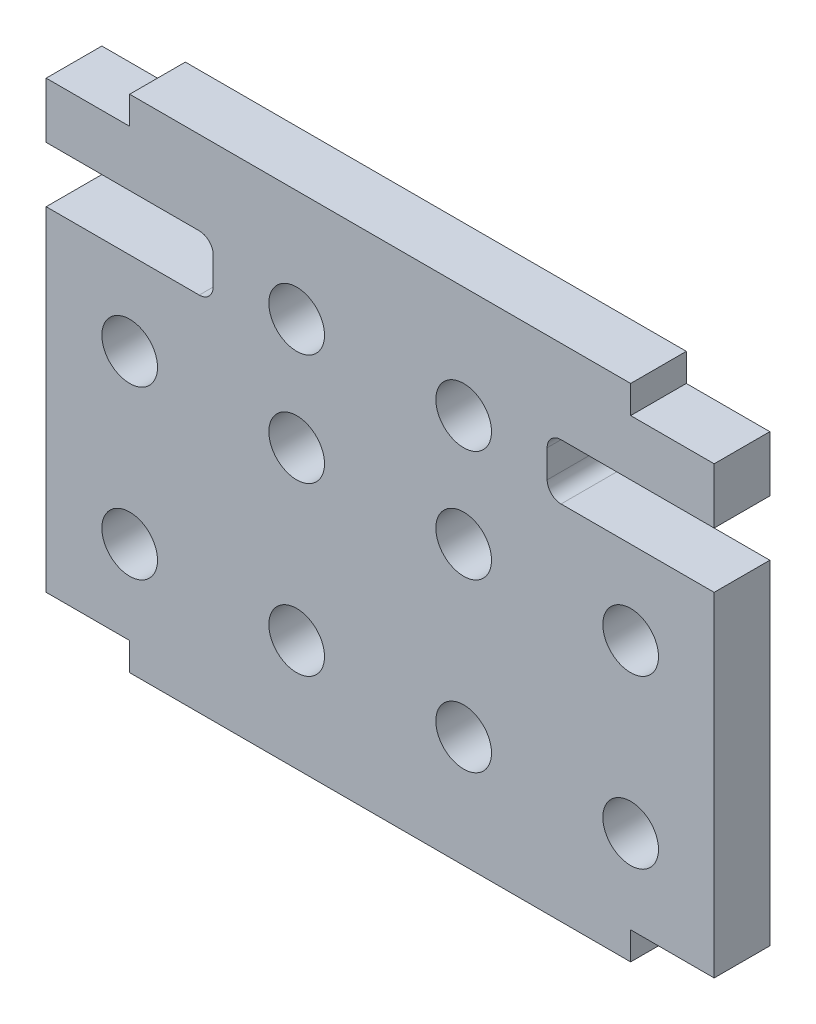
ISO-10303-21;
HEADER;
FILE_DESCRIPTION(('STEP AP214'),'2;1');
FILE_NAME('part.step','',(''),(''),'','','');
FILE_SCHEMA(('AUTOMOTIVE_DESIGN { 1 0 10303 214 1 1 1 1 }'));
ENDSEC;
DATA;
#1=APPLICATION_CONTEXT('core data for automotive mechanical design processes');
#2=APPLICATION_PROTOCOL_DEFINITION('international standard','automotive_design',2000,#1);
#3=PRODUCT_CONTEXT('',#1,'mechanical');
#4=PRODUCT('Part','Part','',(#3));
#5=PRODUCT_RELATED_PRODUCT_CATEGORY('part','',(#4));
#6=PRODUCT_DEFINITION_FORMATION('','',#4);
#7=PRODUCT_DEFINITION_CONTEXT('part definition',#1,'design');
#8=PRODUCT_DEFINITION('design','',#6,#7);
#9=PRODUCT_DEFINITION_SHAPE('','',#8);
#10=(LENGTH_UNIT() NAMED_UNIT(*) SI_UNIT(.MILLI.,.METRE.));
#11=(NAMED_UNIT(*) PLANE_ANGLE_UNIT() SI_UNIT($,.RADIAN.));
#12=(NAMED_UNIT(*) SI_UNIT($,.STERADIAN.) SOLID_ANGLE_UNIT());
#13=UNCERTAINTY_MEASURE_WITH_UNIT(LENGTH_MEASURE(1.E-05),#10,'distance_accuracy_value','');
#14=(GEOMETRIC_REPRESENTATION_CONTEXT(3) GLOBAL_UNCERTAINTY_ASSIGNED_CONTEXT((#13)) GLOBAL_UNIT_ASSIGNED_CONTEXT((#10,
#11,#12)) REPRESENTATION_CONTEXT('',''));
#15=CARTESIAN_POINT('',(0.,0.,0.));
#16=DIRECTION('',(0.,0.,1.));
#17=DIRECTION('',(1.,0.,0.));
#18=AXIS2_PLACEMENT_3D('',#15,#16,#17);
#19=CARTESIAN_POINT('',(114.1251726557,201.3393309863,3.));
#20=DIRECTION('',(0.,0.,1.));
#21=DIRECTION('',(1.,0.,0.));
#22=AXIS2_PLACEMENT_3D('',#19,#20,#21);
#23=PLANE('',#22);
#24=CARTESIAN_POINT('',(110.3751723055,194.5893309863,3.));
#25=DIRECTION('',(0.,0.,1.));
#26=DIRECTION('',(1.,0.,0.));
#27=AXIS2_PLACEMENT_3D('',#24,#25,#26);
#28=CIRCLE('',#27,1.5);
#29=CARTESIAN_POINT('',(111.8751723055,194.5893309863,3.));
#30=VERTEX_POINT('',#29);
#31=EDGE_CURVE('E472',#30,#30,#28,.T.);
#32=ORIENTED_EDGE('',*,*,#31,.F.);
#33=EDGE_LOOP('',(#32));
#34=FACE_BOUND('',#33,.T.);
#35=CARTESIAN_POINT('',(137.3751723055,194.5893309863,3.));
#36=DIRECTION('',(0.,0.,1.));
#37=DIRECTION('',(1.,0.,0.));
#38=AXIS2_PLACEMENT_3D('',#35,#36,#37);
#39=CIRCLE('',#38,1.5);
#40=CARTESIAN_POINT('',(138.8751723055,194.5893309863,3.));
#41=VERTEX_POINT('',#40);
#42=EDGE_CURVE('E484',#41,#41,#39,.T.);
#43=ORIENTED_EDGE('',*,*,#42,.F.);
#44=EDGE_LOOP('',(#43));
#45=FACE_BOUND('',#44,.T.);
#46=CARTESIAN_POINT('',(110.3751723055,185.5893309863,3.));
#47=DIRECTION('',(0.,0.,1.));
#48=DIRECTION('',(1.,0.,0.));
#49=AXIS2_PLACEMENT_3D('',#46,#47,#48);
#50=CIRCLE('',#49,1.5);
#51=CARTESIAN_POINT('',(111.8751723055,185.5893309863,3.));
#52=VERTEX_POINT('',#51);
#53=EDGE_CURVE('E496',#52,#52,#50,.T.);
#54=ORIENTED_EDGE('',*,*,#53,.F.);
#55=EDGE_LOOP('',(#54));
#56=FACE_BOUND('',#55,.T.);
#57=CARTESIAN_POINT('',(137.3751723055,185.5893309863,3.));
#58=DIRECTION('',(0.,0.,1.));
#59=DIRECTION('',(1.,0.,0.));
#60=AXIS2_PLACEMENT_3D('',#57,#58,#59);
#61=CIRCLE('',#60,1.5);
#62=CARTESIAN_POINT('',(138.8751723055,185.5893309863,3.));
#63=VERTEX_POINT('',#62);
#64=EDGE_CURVE('E508',#63,#63,#61,.T.);
#65=ORIENTED_EDGE('',*,*,#64,.F.);
#66=EDGE_LOOP('',(#65));
#67=FACE_BOUND('',#66,.T.);
#68=CARTESIAN_POINT('',(128.3751726557,200.5893309863,3.));
#69=DIRECTION('',(0.,0.,1.));
#70=DIRECTION('',(1.,0.,0.));
#71=AXIS2_PLACEMENT_3D('',#68,#69,#70);
#72=CIRCLE('',#71,1.5);
#73=CARTESIAN_POINT('',(129.8751726557,200.5893309863,3.));
#74=VERTEX_POINT('',#73);
#75=EDGE_CURVE('E230',#74,#74,#72,.T.);
#76=ORIENTED_EDGE('',*,*,#75,.F.);
#77=EDGE_LOOP('',(#76));
#78=FACE_BOUND('',#77,.T.);
#79=CARTESIAN_POINT('',(114.1251726557,201.3393309863,3.));
#80=DIRECTION('',(0.,0.,-1.));
#81=DIRECTION('',(1.,0.,0.));
#82=AXIS2_PLACEMENT_3D('',#79,#80,#81);
#83=CIRCLE('',#82,0.750000000000001);
#84=CARTESIAN_POINT('',(114.1251726557,202.0893309863,3.));
#85=VERTEX_POINT('',#84);
#86=CARTESIAN_POINT('',(114.8751726557,201.3393309863,3.));
#87=VERTEX_POINT('',#86);
#88=EDGE_CURVE('E273',#85,#87,#83,.T.);
#89=ORIENTED_EDGE('',*,*,#88,.T.);
#90=DIRECTION('',(0.,-1.,0.));
#91=VECTOR('',#90,1.);
#92=CARTESIAN_POINT('',(114.8751726557,201.3393309863,3.));
#93=LINE('',#92,#91);
#94=CARTESIAN_POINT('',(114.8751726557,199.8393309863,3.));
#95=VERTEX_POINT('',#94);
#96=EDGE_CURVE('E141',#87,#95,#93,.T.);
#97=ORIENTED_EDGE('',*,*,#96,.T.);
#98=CARTESIAN_POINT('',(114.1251726557,199.8393309863,3.));
#99=DIRECTION('',(0.,0.,-1.));
#100=DIRECTION('',(1.,0.,0.));
#101=AXIS2_PLACEMENT_3D('',#98,#99,#100);
#102=CIRCLE('',#101,0.750000000000001);
#103=CARTESIAN_POINT('',(114.1251726557,199.0893309863,3.));
#104=VERTEX_POINT('',#103);
#105=EDGE_CURVE('E336',#95,#104,#102,.T.);
#106=ORIENTED_EDGE('',*,*,#105,.T.);
#107=DIRECTION('',(-1.,0.,0.));
#108=VECTOR('',#107,1.);
#109=CARTESIAN_POINT('',(114.1251726557,199.0893309863,3.));
#110=LINE('',#109,#108);
#111=CARTESIAN_POINT('',(105.8751726557,199.0893309863,3.));
#112=VERTEX_POINT('',#111);
#113=EDGE_CURVE('E355',#104,#112,#110,.T.);
#114=ORIENTED_EDGE('',*,*,#113,.T.);
#115=DIRECTION('',(0.,-1.,0.));
#116=VECTOR('',#115,1.);
#117=CARTESIAN_POINT('',(105.8751726557,199.0893309863,3.));
#118=LINE('',#117,#116);
#119=CARTESIAN_POINT('',(105.8751726557,181.0893309863,3.));
#120=VERTEX_POINT('',#119);
#121=EDGE_CURVE('E352',#112,#120,#118,.T.);
#122=ORIENTED_EDGE('',*,*,#121,.T.);
#123=DIRECTION('',(1.,0.,0.));
#124=VECTOR('',#123,1.);
#125=CARTESIAN_POINT('',(110.3751723055,181.0893309863,3.));
#126=LINE('',#125,#124);
#127=CARTESIAN_POINT('',(110.3751723055,181.0893309863,3.));
#128=VERTEX_POINT('',#127);
#129=EDGE_CURVE('E354',#120,#128,#126,.T.);
#130=ORIENTED_EDGE('',*,*,#129,.T.);
#131=DIRECTION('',(0.,-1.,0.));
#132=VECTOR('',#131,1.);
#133=CARTESIAN_POINT('',(110.3751723055,179.5893309863,3.));
#134=LINE('',#133,#132);
#135=CARTESIAN_POINT('',(110.3751723055,179.5893309863,3.));
#136=VERTEX_POINT('',#135);
#137=EDGE_CURVE('E357',#128,#136,#134,.T.);
#138=ORIENTED_EDGE('',*,*,#137,.T.);
#139=DIRECTION('',(1.,0.,0.));
#140=VECTOR('',#139,1.);
#141=CARTESIAN_POINT('',(137.3751726557,179.5893309863,3.));
#142=LINE('',#141,#140);
#143=CARTESIAN_POINT('',(137.3751726557,179.5893309863,3.));
#144=VERTEX_POINT('',#143);
#145=EDGE_CURVE('E363',#136,#144,#142,.T.);
#146=ORIENTED_EDGE('',*,*,#145,.T.);
#147=DIRECTION('',(0.,1.,0.));
#148=VECTOR('',#147,1.);
#149=CARTESIAN_POINT('',(137.3751726557,181.0893309863,3.));
#150=LINE('',#149,#148);
#151=CARTESIAN_POINT('',(137.3751726557,181.0893309863,3.));
#152=VERTEX_POINT('',#151);
#153=EDGE_CURVE('E365',#144,#152,#150,.T.);
#154=ORIENTED_EDGE('',*,*,#153,.T.);
#155=DIRECTION('',(1.,0.,0.));
#156=VECTOR('',#155,1.);
#157=CARTESIAN_POINT('',(141.8751726557,181.0893309863,3.));
#158=LINE('',#157,#156);
#159=CARTESIAN_POINT('',(141.8751726557,181.0893309863,3.));
#160=VERTEX_POINT('',#159);
#161=EDGE_CURVE('E367',#152,#160,#158,.T.);
#162=ORIENTED_EDGE('',*,*,#161,.T.);
#163=DIRECTION('',(0.,1.,0.));
#164=VECTOR('',#163,1.);
#165=CARTESIAN_POINT('',(141.8751726557,199.0893309863,3.));
#166=LINE('',#165,#164);
#167=CARTESIAN_POINT('',(141.8751726557,199.0893309863,3.));
#168=VERTEX_POINT('',#167);
#169=EDGE_CURVE('E369',#160,#168,#166,.T.);
#170=ORIENTED_EDGE('',*,*,#169,.T.);
#171=DIRECTION('',(-0.99999999999909,-1.34897035860248E-06,0.));
#172=VECTOR('',#171,1.);
#173=CARTESIAN_POINT('',(133.6251767026,199.0893198573,3.));
#174=LINE('',#173,#172);
#175=CARTESIAN_POINT('',(133.6251767026,199.0893198573,3.));
#176=VERTEX_POINT('',#175);
#177=EDGE_CURVE('E371',#168,#176,#174,.T.);
#178=ORIENTED_EDGE('',*,*,#177,.T.);
#179=CARTESIAN_POINT('',(133.625175690899,199.839319857299,3.));
#180=DIRECTION('',(0.,0.,-1.));
#181=DIRECTION('',(1.,0.,0.));
#182=AXIS2_PLACEMENT_3D('',#179,#180,#181);
#183=CIRCLE('',#182,0.750000000000003);
#184=CARTESIAN_POINT('',(132.8751756909,199.8393188456,3.));
#185=VERTEX_POINT('',#184);
#186=EDGE_CURVE('E373',#176,#185,#183,.T.);
#187=ORIENTED_EDGE('',*,*,#186,.T.);
#188=DIRECTION('',(-1.34900000429397E-06,0.99999999999909,0.));
#189=VECTOR('',#188,1.);
#190=CARTESIAN_POINT('',(132.8751756909,199.8393188456,3.));
#191=LINE('',#190,#189);
#192=CARTESIAN_POINT('',(132.8751736674,201.3393188456,3.));
#193=VERTEX_POINT('',#192);
#194=EDGE_CURVE('E375',#185,#193,#191,.T.);
#195=ORIENTED_EDGE('',*,*,#194,.T.);
#196=CARTESIAN_POINT('',(133.625173667399,201.339319857301,3.));
#197=DIRECTION('',(0.,0.,-1.));
#198=DIRECTION('',(1.,0.,0.));
#199=AXIS2_PLACEMENT_3D('',#196,#197,#198);
#200=CIRCLE('',#199,0.749999999999989);
#201=CARTESIAN_POINT('',(133.6251726557,202.0893198573,3.));
#202=VERTEX_POINT('',#201);
#203=EDGE_CURVE('E377',#193,#202,#200,.T.);
#204=ORIENTED_EDGE('',*,*,#203,.T.);
#205=DIRECTION('',(0.99999999999909,1.34896969688756E-06,0.));
#206=VECTOR('',#205,1.);
#207=CARTESIAN_POINT('',(133.6251726557,202.0893198573,3.));
#208=LINE('',#207,#206);
#209=CARTESIAN_POINT('',(141.8751726557,202.0893309863,3.));
#210=VERTEX_POINT('',#209);
#211=EDGE_CURVE('E379',#202,#210,#208,.T.);
#212=ORIENTED_EDGE('',*,*,#211,.T.);
#213=DIRECTION('',(0.,1.,0.));
#214=VECTOR('',#213,1.);
#215=CARTESIAN_POINT('',(141.8751726557,205.0893309863,3.));
#216=LINE('',#215,#214);
#217=CARTESIAN_POINT('',(141.8751726557,205.0893309863,3.));
#218=VERTEX_POINT('',#217);
#219=EDGE_CURVE('E381',#210,#218,#216,.T.);
#220=ORIENTED_EDGE('',*,*,#219,.T.);
#221=DIRECTION('',(-1.,0.,0.));
#222=VECTOR('',#221,1.);
#223=CARTESIAN_POINT('',(137.3751726557,205.0893309863,3.));
#224=LINE('',#223,#222);
#225=CARTESIAN_POINT('',(137.3751726557,205.0893309863,3.));
#226=VERTEX_POINT('',#225);
#227=EDGE_CURVE('E383',#218,#226,#224,.T.);
#228=ORIENTED_EDGE('',*,*,#227,.T.);
#229=DIRECTION('',(0.,1.,0.));
#230=VECTOR('',#229,1.);
#231=CARTESIAN_POINT('',(137.3751726557,206.5893309863,3.));
#232=LINE('',#231,#230);
#233=CARTESIAN_POINT('',(137.3751726557,206.5893309863,3.));
#234=VERTEX_POINT('',#233);
#235=EDGE_CURVE('E385',#226,#234,#232,.T.);
#236=ORIENTED_EDGE('',*,*,#235,.T.);
#237=DIRECTION('',(-1.,0.,0.));
#238=VECTOR('',#237,1.);
#239=CARTESIAN_POINT('',(110.3751723055,206.5893309863,3.));
#240=LINE('',#239,#238);
#241=CARTESIAN_POINT('',(110.3751723055,206.5893309863,3.));
#242=VERTEX_POINT('',#241);
#243=EDGE_CURVE('E387',#234,#242,#240,.T.);
#244=ORIENTED_EDGE('',*,*,#243,.T.);
#245=DIRECTION('',(0.,-1.,0.));
#246=VECTOR('',#245,1.);
#247=CARTESIAN_POINT('',(110.3751723055,205.0893309863,3.));
#248=LINE('',#247,#246);
#249=CARTESIAN_POINT('',(110.3751723055,205.0893309863,3.));
#250=VERTEX_POINT('',#249);
#251=EDGE_CURVE('E208',#242,#250,#248,.T.);
#252=ORIENTED_EDGE('',*,*,#251,.T.);
#253=DIRECTION('',(-1.,0.,0.));
#254=VECTOR('',#253,1.);
#255=CARTESIAN_POINT('',(110.3751723055,205.0893309863,3.));
#256=LINE('',#255,#254);
#257=CARTESIAN_POINT('',(105.8751726557,205.0893309863,3.));
#258=VERTEX_POINT('',#257);
#259=EDGE_CURVE('E202',#250,#258,#256,.T.);
#260=ORIENTED_EDGE('',*,*,#259,.T.);
#261=DIRECTION('',(0.,-1.,0.));
#262=VECTOR('',#261,1.);
#263=CARTESIAN_POINT('',(105.8751726557,202.0893309863,3.));
#264=LINE('',#263,#262);
#265=CARTESIAN_POINT('',(105.8751726557,202.0893309863,3.));
#266=VERTEX_POINT('',#265);
#267=EDGE_CURVE('E206',#258,#266,#264,.T.);
#268=ORIENTED_EDGE('',*,*,#267,.T.);
#269=DIRECTION('',(1.,0.,0.));
#270=VECTOR('',#269,1.);
#271=CARTESIAN_POINT('',(114.1251726557,202.0893309863,3.));
#272=LINE('',#271,#270);
#273=EDGE_CURVE('E50',#266,#85,#272,.T.);
#274=ORIENTED_EDGE('',*,*,#273,.T.);
#275=EDGE_LOOP('',(#89,#97,#106,#114,#122,#130,#138,#146,#154,#162,#170,#178,#187,#195,#204,
#212,#220,#228,#236,#244,#252,#260,#268,#274));
#276=FACE_BOUND('',#275,.T.);
#277=CARTESIAN_POINT('',(119.3751726557,200.5893309863,3.));
#278=DIRECTION('',(0.,0.,1.));
#279=DIRECTION('',(1.,0.,0.));
#280=AXIS2_PLACEMENT_3D('',#277,#278,#279);
#281=CIRCLE('',#280,1.5);
#282=CARTESIAN_POINT('',(120.8751726557,200.5893309863,3.));
#283=VERTEX_POINT('',#282);
#284=EDGE_CURVE('E514',#283,#283,#281,.T.);
#285=ORIENTED_EDGE('',*,*,#284,.F.);
#286=EDGE_LOOP('',(#285));
#287=FACE_BOUND('',#286,.T.);
#288=CARTESIAN_POINT('',(128.3751723055,185.5893309863,3.));
#289=DIRECTION('',(0.,0.,1.));
#290=DIRECTION('',(1.,0.,0.));
#291=AXIS2_PLACEMENT_3D('',#288,#289,#290);
#292=CIRCLE('',#291,1.5);
#293=CARTESIAN_POINT('',(129.8751723055,185.5893309863,3.));
#294=VERTEX_POINT('',#293);
#295=EDGE_CURVE('E502',#294,#294,#292,.T.);
#296=ORIENTED_EDGE('',*,*,#295,.F.);
#297=EDGE_LOOP('',(#296));
#298=FACE_BOUND('',#297,.T.);
#299=CARTESIAN_POINT('',(119.3751723055,185.5893309863,3.));
#300=DIRECTION('',(0.,0.,1.));
#301=DIRECTION('',(1.,0.,0.));
#302=AXIS2_PLACEMENT_3D('',#299,#300,#301);
#303=CIRCLE('',#302,1.5);
#304=CARTESIAN_POINT('',(120.8751723055,185.5893309863,3.));
#305=VERTEX_POINT('',#304);
#306=EDGE_CURVE('E490',#305,#305,#303,.T.);
#307=ORIENTED_EDGE('',*,*,#306,.F.);
#308=EDGE_LOOP('',(#307));
#309=FACE_BOUND('',#308,.T.);
#310=CARTESIAN_POINT('',(128.3751723055,194.5893309863,3.));
#311=DIRECTION('',(0.,0.,1.));
#312=DIRECTION('',(1.,0.,0.));
#313=AXIS2_PLACEMENT_3D('',#310,#311,#312);
#314=CIRCLE('',#313,1.5);
#315=CARTESIAN_POINT('',(129.8751723055,194.5893309863,3.));
#316=VERTEX_POINT('',#315);
#317=EDGE_CURVE('E478',#316,#316,#314,.T.);
#318=ORIENTED_EDGE('',*,*,#317,.F.);
#319=EDGE_LOOP('',(#318));
#320=FACE_BOUND('',#319,.T.);
#321=CARTESIAN_POINT('',(119.3751723055,194.5893309863,3.));
#322=DIRECTION('',(0.,0.,1.));
#323=DIRECTION('',(1.,0.,0.));
#324=AXIS2_PLACEMENT_3D('',#321,#322,#323);
#325=CIRCLE('',#324,1.5);
#326=CARTESIAN_POINT('',(120.8751723055,194.5893309863,3.));
#327=VERTEX_POINT('',#326);
#328=EDGE_CURVE('E463',#327,#327,#325,.T.);
#329=ORIENTED_EDGE('',*,*,#328,.F.);
#330=EDGE_LOOP('',(#329));
#331=FACE_BOUND('',#330,.T.);
#332=ADVANCED_FACE('F33',(#34,#45,#56,#67,#78,#276,#287,#298,#309,#320,#331),#23,.T.);
#333=CARTESIAN_POINT('',(114.1251726557,201.3393309863,0.));
#334=DIRECTION('',(0.,0.,1.));
#335=DIRECTION('',(1.,0.,0.));
#336=AXIS2_PLACEMENT_3D('',#333,#334,#335);
#337=PLANE('',#336);
#338=CARTESIAN_POINT('',(110.3751723055,194.5893309863,0.));
#339=DIRECTION('',(0.,0.,1.));
#340=DIRECTION('',(1.,0.,0.));
#341=AXIS2_PLACEMENT_3D('',#338,#339,#340);
#342=CIRCLE('',#341,1.5);
#343=CARTESIAN_POINT('',(111.8751723055,194.5893309863,0.));
#344=VERTEX_POINT('',#343);
#345=EDGE_CURVE('E469',#344,#344,#342,.T.);
#346=ORIENTED_EDGE('',*,*,#345,.T.);
#347=EDGE_LOOP('',(#346));
#348=FACE_BOUND('',#347,.T.);
#349=CARTESIAN_POINT('',(137.3751723055,194.5893309863,0.));
#350=DIRECTION('',(0.,0.,1.));
#351=DIRECTION('',(1.,0.,0.));
#352=AXIS2_PLACEMENT_3D('',#349,#350,#351);
#353=CIRCLE('',#352,1.5);
#354=CARTESIAN_POINT('',(138.8751723055,194.5893309863,0.));
#355=VERTEX_POINT('',#354);
#356=EDGE_CURVE('E481',#355,#355,#353,.T.);
#357=ORIENTED_EDGE('',*,*,#356,.T.);
#358=EDGE_LOOP('',(#357));
#359=FACE_BOUND('',#358,.T.);
#360=CARTESIAN_POINT('',(110.3751723055,185.5893309863,0.));
#361=DIRECTION('',(0.,0.,1.));
#362=DIRECTION('',(1.,0.,0.));
#363=AXIS2_PLACEMENT_3D('',#360,#361,#362);
#364=CIRCLE('',#363,1.5);
#365=CARTESIAN_POINT('',(111.8751723055,185.5893309863,0.));
#366=VERTEX_POINT('',#365);
#367=EDGE_CURVE('E493',#366,#366,#364,.T.);
#368=ORIENTED_EDGE('',*,*,#367,.T.);
#369=EDGE_LOOP('',(#368));
#370=FACE_BOUND('',#369,.T.);
#371=CARTESIAN_POINT('',(137.3751723055,185.5893309863,0.));
#372=DIRECTION('',(0.,0.,1.));
#373=DIRECTION('',(1.,0.,0.));
#374=AXIS2_PLACEMENT_3D('',#371,#372,#373);
#375=CIRCLE('',#374,1.5);
#376=CARTESIAN_POINT('',(138.8751723055,185.5893309863,0.));
#377=VERTEX_POINT('',#376);
#378=EDGE_CURVE('E505',#377,#377,#375,.T.);
#379=ORIENTED_EDGE('',*,*,#378,.T.);
#380=EDGE_LOOP('',(#379));
#381=FACE_BOUND('',#380,.T.);
#382=CARTESIAN_POINT('',(128.3751726557,200.5893309863,0.));
#383=DIRECTION('',(0.,0.,1.));
#384=DIRECTION('',(1.,0.,0.));
#385=AXIS2_PLACEMENT_3D('',#382,#383,#384);
#386=CIRCLE('',#385,1.5);
#387=CARTESIAN_POINT('',(129.8751726557,200.5893309863,0.));
#388=VERTEX_POINT('',#387);
#389=EDGE_CURVE('E517',#388,#388,#386,.T.);
#390=ORIENTED_EDGE('',*,*,#389,.T.);
#391=EDGE_LOOP('',(#390));
#392=FACE_BOUND('',#391,.T.);
#393=CARTESIAN_POINT('',(114.1251726557,201.3393309863,0.));
#394=DIRECTION('',(0.,0.,-1.));
#395=DIRECTION('',(1.,0.,0.));
#396=AXIS2_PLACEMENT_3D('',#393,#394,#395);
#397=CIRCLE('',#396,0.750000000000001);
#398=CARTESIAN_POINT('',(114.1251726557,202.0893309863,0.));
#399=VERTEX_POINT('',#398);
#400=CARTESIAN_POINT('',(114.8751726557,201.3393309863,0.));
#401=VERTEX_POINT('',#400);
#402=EDGE_CURVE('E226',#399,#401,#397,.T.);
#403=ORIENTED_EDGE('',*,*,#402,.F.);
#404=DIRECTION('',(1.,0.,0.));
#405=VECTOR('',#404,1.);
#406=CARTESIAN_POINT('',(114.1251726557,202.0893309863,0.));
#407=LINE('',#406,#405);
#408=CARTESIAN_POINT('',(105.8751726557,202.0893309863,0.));
#409=VERTEX_POINT('',#408);
#410=EDGE_CURVE('E133',#409,#399,#407,.T.);
#411=ORIENTED_EDGE('',*,*,#410,.F.);
#412=DIRECTION('',(0.,-1.,0.));
#413=VECTOR('',#412,1.);
#414=CARTESIAN_POINT('',(105.8751726557,202.0893309863,0.));
#415=LINE('',#414,#413);
#416=CARTESIAN_POINT('',(105.8751726557,205.0893309863,0.));
#417=VERTEX_POINT('',#416);
#418=EDGE_CURVE('E127',#417,#409,#415,.T.);
#419=ORIENTED_EDGE('',*,*,#418,.F.);
#420=DIRECTION('',(-1.,0.,0.));
#421=VECTOR('',#420,1.);
#422=CARTESIAN_POINT('',(110.3751723055,205.0893309863,0.));
#423=LINE('',#422,#421);
#424=CARTESIAN_POINT('',(110.3751723055,205.0893309863,0.));
#425=VERTEX_POINT('',#424);
#426=EDGE_CURVE('E216',#425,#417,#423,.T.);
#427=ORIENTED_EDGE('',*,*,#426,.F.);
#428=DIRECTION('',(0.,-1.,0.));
#429=VECTOR('',#428,1.);
#430=CARTESIAN_POINT('',(110.3751723055,205.0893309863,0.));
#431=LINE('',#430,#429);
#432=CARTESIAN_POINT('',(110.3751723055,206.5893309863,0.));
#433=VERTEX_POINT('',#432);
#434=EDGE_CURVE('E268',#433,#425,#431,.T.);
#435=ORIENTED_EDGE('',*,*,#434,.F.);
#436=DIRECTION('',(-1.,0.,0.));
#437=VECTOR('',#436,1.);
#438=CARTESIAN_POINT('',(110.3751723055,206.5893309863,0.));
#439=LINE('',#438,#437);
#440=CARTESIAN_POINT('',(137.3751726557,206.5893309863,0.));
#441=VERTEX_POINT('',#440);
#442=EDGE_CURVE('E266',#441,#433,#439,.T.);
#443=ORIENTED_EDGE('',*,*,#442,.F.);
#444=DIRECTION('',(0.,1.,0.));
#445=VECTOR('',#444,1.);
#446=CARTESIAN_POINT('',(137.3751726557,206.5893309863,0.));
#447=LINE('',#446,#445);
#448=CARTESIAN_POINT('',(137.3751726557,205.0893309863,0.));
#449=VERTEX_POINT('',#448);
#450=EDGE_CURVE('E264',#449,#441,#447,.T.);
#451=ORIENTED_EDGE('',*,*,#450,.F.);
#452=DIRECTION('',(-1.,0.,0.));
#453=VECTOR('',#452,1.);
#454=CARTESIAN_POINT('',(137.3751726557,205.0893309863,0.));
#455=LINE('',#454,#453);
#456=CARTESIAN_POINT('',(141.8751726557,205.0893309863,0.));
#457=VERTEX_POINT('',#456);
#458=EDGE_CURVE('E262',#457,#449,#455,.T.);
#459=ORIENTED_EDGE('',*,*,#458,.F.);
#460=DIRECTION('',(0.,1.,0.));
#461=VECTOR('',#460,1.);
#462=CARTESIAN_POINT('',(141.8751726557,205.0893309863,0.));
#463=LINE('',#462,#461);
#464=CARTESIAN_POINT('',(141.8751726557,202.0893309863,0.));
#465=VERTEX_POINT('',#464);
#466=EDGE_CURVE('E260',#465,#457,#463,.T.);
#467=ORIENTED_EDGE('',*,*,#466,.F.);
#468=DIRECTION('',(0.99999999999909,1.34896969688756E-06,0.));
#469=VECTOR('',#468,1.);
#470=CARTESIAN_POINT('',(133.6251726557,202.0893198573,0.));
#471=LINE('',#470,#469);
#472=CARTESIAN_POINT('',(133.6251726557,202.0893198573,0.));
#473=VERTEX_POINT('',#472);
#474=EDGE_CURVE('E258',#473,#465,#471,.T.);
#475=ORIENTED_EDGE('',*,*,#474,.F.);
#476=CARTESIAN_POINT('',(133.625173667399,201.339319857301,0.));
#477=DIRECTION('',(0.,0.,-1.));
#478=DIRECTION('',(1.,0.,0.));
#479=AXIS2_PLACEMENT_3D('',#476,#477,#478);
#480=CIRCLE('',#479,0.749999999999989);
#481=CARTESIAN_POINT('',(132.8751736674,201.3393188456,0.));
#482=VERTEX_POINT('',#481);
#483=EDGE_CURVE('E256',#482,#473,#480,.T.);
#484=ORIENTED_EDGE('',*,*,#483,.F.);
#485=DIRECTION('',(-1.34900000429397E-06,0.99999999999909,0.));
#486=VECTOR('',#485,1.);
#487=CARTESIAN_POINT('',(132.8751756909,199.8393188456,0.));
#488=LINE('',#487,#486);
#489=CARTESIAN_POINT('',(132.8751756909,199.8393188456,0.));
#490=VERTEX_POINT('',#489);
#491=EDGE_CURVE('E254',#490,#482,#488,.T.);
#492=ORIENTED_EDGE('',*,*,#491,.F.);
#493=CARTESIAN_POINT('',(133.625175690899,199.839319857299,0.));
#494=DIRECTION('',(0.,0.,-1.));
#495=DIRECTION('',(1.,0.,0.));
#496=AXIS2_PLACEMENT_3D('',#493,#494,#495);
#497=CIRCLE('',#496,0.750000000000003);
#498=CARTESIAN_POINT('',(133.6251767026,199.0893198573,0.));
#499=VERTEX_POINT('',#498);
#500=EDGE_CURVE('E252',#499,#490,#497,.T.);
#501=ORIENTED_EDGE('',*,*,#500,.F.);
#502=DIRECTION('',(-0.99999999999909,-1.34897035860248E-06,0.));
#503=VECTOR('',#502,1.);
#504=CARTESIAN_POINT('',(133.6251767026,199.0893198573,0.));
#505=LINE('',#504,#503);
#506=CARTESIAN_POINT('',(141.8751726557,199.0893309863,0.));
#507=VERTEX_POINT('',#506);
#508=EDGE_CURVE('E250',#507,#499,#505,.T.);
#509=ORIENTED_EDGE('',*,*,#508,.F.);
#510=DIRECTION('',(0.,1.,0.));
#511=VECTOR('',#510,1.);
#512=CARTESIAN_POINT('',(141.8751726557,199.0893309863,0.));
#513=LINE('',#512,#511);
#514=CARTESIAN_POINT('',(141.8751726557,181.0893309863,0.));
#515=VERTEX_POINT('',#514);
#516=EDGE_CURVE('E248',#515,#507,#513,.T.);
#517=ORIENTED_EDGE('',*,*,#516,.F.);
#518=DIRECTION('',(1.,0.,0.));
#519=VECTOR('',#518,1.);
#520=CARTESIAN_POINT('',(141.8751726557,181.0893309863,0.));
#521=LINE('',#520,#519);
#522=CARTESIAN_POINT('',(137.3751726557,181.0893309863,0.));
#523=VERTEX_POINT('',#522);
#524=EDGE_CURVE('E246',#523,#515,#521,.T.);
#525=ORIENTED_EDGE('',*,*,#524,.F.);
#526=DIRECTION('',(0.,1.,0.));
#527=VECTOR('',#526,1.);
#528=CARTESIAN_POINT('',(137.3751726557,181.0893309863,0.));
#529=LINE('',#528,#527);
#530=CARTESIAN_POINT('',(137.3751726557,179.5893309863,0.));
#531=VERTEX_POINT('',#530);
#532=EDGE_CURVE('E244',#531,#523,#529,.T.);
#533=ORIENTED_EDGE('',*,*,#532,.F.);
#534=DIRECTION('',(1.,0.,0.));
#535=VECTOR('',#534,1.);
#536=CARTESIAN_POINT('',(137.3751726557,179.5893309863,0.));
#537=LINE('',#536,#535);
#538=CARTESIAN_POINT('',(110.3751723055,179.5893309863,0.));
#539=VERTEX_POINT('',#538);
#540=EDGE_CURVE('E242',#539,#531,#537,.T.);
#541=ORIENTED_EDGE('',*,*,#540,.F.);
#542=DIRECTION('',(0.,-1.,0.));
#543=VECTOR('',#542,1.);
#544=CARTESIAN_POINT('',(110.3751723055,179.5893309863,0.));
#545=LINE('',#544,#543);
#546=CARTESIAN_POINT('',(110.3751723055,181.0893309863,0.));
#547=VERTEX_POINT('',#546);
#548=EDGE_CURVE('E240',#547,#539,#545,.T.);
#549=ORIENTED_EDGE('',*,*,#548,.F.);
#550=DIRECTION('',(1.,0.,0.));
#551=VECTOR('',#550,1.);
#552=CARTESIAN_POINT('',(110.3751723055,181.0893309863,0.));
#553=LINE('',#552,#551);
#554=CARTESIAN_POINT('',(105.8751726557,181.0893309863,0.));
#555=VERTEX_POINT('',#554);
#556=EDGE_CURVE('E238',#555,#547,#553,.T.);
#557=ORIENTED_EDGE('',*,*,#556,.F.);
#558=DIRECTION('',(0.,-1.,0.));
#559=VECTOR('',#558,1.);
#560=CARTESIAN_POINT('',(105.8751726557,199.0893309863,0.));
#561=LINE('',#560,#559);
#562=CARTESIAN_POINT('',(105.8751726557,199.0893309863,0.));
#563=VERTEX_POINT('',#562);
#564=EDGE_CURVE('E236',#563,#555,#561,.T.);
#565=ORIENTED_EDGE('',*,*,#564,.F.);
#566=DIRECTION('',(-1.,0.,0.));
#567=VECTOR('',#566,1.);
#568=CARTESIAN_POINT('',(114.1251726557,199.0893309863,0.));
#569=LINE('',#568,#567);
#570=CARTESIAN_POINT('',(114.1251726557,199.0893309863,0.));
#571=VERTEX_POINT('',#570);
#572=EDGE_CURVE('E234',#571,#563,#569,.T.);
#573=ORIENTED_EDGE('',*,*,#572,.F.);
#574=CARTESIAN_POINT('',(114.1251726557,199.8393309863,0.));
#575=DIRECTION('',(0.,0.,-1.));
#576=DIRECTION('',(1.,0.,0.));
#577=AXIS2_PLACEMENT_3D('',#574,#575,#576);
#578=CIRCLE('',#577,0.750000000000001);
#579=CARTESIAN_POINT('',(114.8751726557,199.8393309863,0.));
#580=VERTEX_POINT('',#579);
#581=EDGE_CURVE('E232',#580,#571,#578,.T.);
#582=ORIENTED_EDGE('',*,*,#581,.F.);
#583=DIRECTION('',(0.,-1.,0.));
#584=VECTOR('',#583,1.);
#585=CARTESIAN_POINT('',(114.8751726557,201.3393309863,0.));
#586=LINE('',#585,#584);
#587=EDGE_CURVE('E229',#401,#580,#586,.T.);
#588=ORIENTED_EDGE('',*,*,#587,.F.);
#589=EDGE_LOOP('',(#403,#411,#419,#427,#435,#443,#451,#459,#467,#475,#484,#492,#501,#509,#517,
#525,#533,#541,#549,#557,#565,#573,#582,#588));
#590=FACE_BOUND('',#589,.T.);
#591=CARTESIAN_POINT('',(119.3751726557,200.5893309863,0.));
#592=DIRECTION('',(0.,0.,1.));
#593=DIRECTION('',(1.,0.,0.));
#594=AXIS2_PLACEMENT_3D('',#591,#592,#593);
#595=CIRCLE('',#594,1.5);
#596=CARTESIAN_POINT('',(120.8751726557,200.5893309863,0.));
#597=VERTEX_POINT('',#596);
#598=EDGE_CURVE('E511',#597,#597,#595,.T.);
#599=ORIENTED_EDGE('',*,*,#598,.T.);
#600=EDGE_LOOP('',(#599));
#601=FACE_BOUND('',#600,.T.);
#602=CARTESIAN_POINT('',(128.3751723055,185.5893309863,0.));
#603=DIRECTION('',(0.,0.,1.));
#604=DIRECTION('',(1.,0.,0.));
#605=AXIS2_PLACEMENT_3D('',#602,#603,#604);
#606=CIRCLE('',#605,1.5);
#607=CARTESIAN_POINT('',(129.8751723055,185.5893309863,0.));
#608=VERTEX_POINT('',#607);
#609=EDGE_CURVE('E499',#608,#608,#606,.T.);
#610=ORIENTED_EDGE('',*,*,#609,.T.);
#611=EDGE_LOOP('',(#610));
#612=FACE_BOUND('',#611,.T.);
#613=CARTESIAN_POINT('',(119.3751723055,185.5893309863,0.));
#614=DIRECTION('',(0.,0.,1.));
#615=DIRECTION('',(1.,0.,0.));
#616=AXIS2_PLACEMENT_3D('',#613,#614,#615);
#617=CIRCLE('',#616,1.5);
#618=CARTESIAN_POINT('',(120.8751723055,185.5893309863,0.));
#619=VERTEX_POINT('',#618);
#620=EDGE_CURVE('E487',#619,#619,#617,.T.);
#621=ORIENTED_EDGE('',*,*,#620,.T.);
#622=EDGE_LOOP('',(#621));
#623=FACE_BOUND('',#622,.T.);
#624=CARTESIAN_POINT('',(128.3751723055,194.5893309863,0.));
#625=DIRECTION('',(0.,0.,1.));
#626=DIRECTION('',(1.,0.,0.));
#627=AXIS2_PLACEMENT_3D('',#624,#625,#626);
#628=CIRCLE('',#627,1.5);
#629=CARTESIAN_POINT('',(129.8751723055,194.5893309863,0.));
#630=VERTEX_POINT('',#629);
#631=EDGE_CURVE('E475',#630,#630,#628,.T.);
#632=ORIENTED_EDGE('',*,*,#631,.T.);
#633=EDGE_LOOP('',(#632));
#634=FACE_BOUND('',#633,.T.);
#635=CARTESIAN_POINT('',(119.3751723055,194.5893309863,0.));
#636=DIRECTION('',(0.,0.,1.));
#637=DIRECTION('',(1.,0.,0.));
#638=AXIS2_PLACEMENT_3D('',#635,#636,#637);
#639=CIRCLE('',#638,1.5);
#640=CARTESIAN_POINT('',(120.8751723055,194.5893309863,0.));
#641=VERTEX_POINT('',#640);
#642=EDGE_CURVE('E466',#641,#641,#639,.T.);
#643=ORIENTED_EDGE('',*,*,#642,.T.);
#644=EDGE_LOOP('',(#643));
#645=FACE_BOUND('',#644,.T.);
#646=ADVANCED_FACE('F340',(#348,#359,#370,#381,#392,#590,#601,#612,#623,#634,#645),#337,.F.);
#647=CARTESIAN_POINT('',(114.1251726557,201.3393309863,3.));
#648=DIRECTION('',(0.,0.,-1.));
#649=DIRECTION('',(-1.,0.,0.));
#650=AXIS2_PLACEMENT_3D('',#647,#648,#649);
#651=CYLINDRICAL_SURFACE('',#650,0.750000000000001);
#652=ORIENTED_EDGE('',*,*,#402,.T.);
#653=DIRECTION('',(0.,0.,-1.));
#654=VECTOR('',#653,1.);
#655=CARTESIAN_POINT('',(114.8751726557,201.3393309863,3.));
#656=LINE('',#655,#654);
#657=EDGE_CURVE('E11',#87,#401,#656,.T.);
#658=ORIENTED_EDGE('',*,*,#657,.F.);
#659=ORIENTED_EDGE('',*,*,#88,.F.);
#660=DIRECTION('',(0.,0.,-1.));
#661=VECTOR('',#660,1.);
#662=CARTESIAN_POINT('',(114.1251726557,202.0893309863,3.));
#663=LINE('',#662,#661);
#664=EDGE_CURVE('E222',#85,#399,#663,.T.);
#665=ORIENTED_EDGE('',*,*,#664,.T.);
#666=EDGE_LOOP('',(#652,#658,#659,#665));
#667=FACE_BOUND('',#666,.T.);
#668=ADVANCED_FACE('F35',(#667),#651,.F.);
#669=CARTESIAN_POINT('',(114.8751726557,201.3393309863,3.));
#670=DIRECTION('',(1.,0.,0.));
#671=DIRECTION('',(0.,0.,-1.));
#672=AXIS2_PLACEMENT_3D('',#669,#670,#671);
#673=PLANE('',#672);
#674=ORIENTED_EDGE('',*,*,#587,.T.);
#675=DIRECTION('',(0.,0.,-1.));
#676=VECTOR('',#675,1.);
#677=CARTESIAN_POINT('',(114.8751726557,199.8393309863,3.));
#678=LINE('',#677,#676);
#679=EDGE_CURVE('E42',#95,#580,#678,.T.);
#680=ORIENTED_EDGE('',*,*,#679,.F.);
#681=ORIENTED_EDGE('',*,*,#96,.F.);
#682=ORIENTED_EDGE('',*,*,#657,.T.);
#683=EDGE_LOOP('',(#674,#680,#681,#682));
#684=FACE_BOUND('',#683,.T.);
#685=ADVANCED_FACE('F800',(#684),#673,.F.);
#686=CARTESIAN_POINT('',(114.1251726557,199.8393309863,3.));
#687=DIRECTION('',(0.,0.,-1.));
#688=DIRECTION('',(-1.,0.,0.));
#689=AXIS2_PLACEMENT_3D('',#686,#687,#688);
#690=CYLINDRICAL_SURFACE('',#689,0.750000000000001);
#691=ORIENTED_EDGE('',*,*,#581,.T.);
#692=DIRECTION('',(0.,0.,-1.));
#693=VECTOR('',#692,1.);
#694=CARTESIAN_POINT('',(114.1251726557,199.0893309863,3.));
#695=LINE('',#694,#693);
#696=EDGE_CURVE('E328',#104,#571,#695,.T.);
#697=ORIENTED_EDGE('',*,*,#696,.F.);
#698=ORIENTED_EDGE('',*,*,#105,.F.);
#699=ORIENTED_EDGE('',*,*,#679,.T.);
#700=EDGE_LOOP('',(#691,#697,#698,#699));
#701=FACE_BOUND('',#700,.T.);
#702=ADVANCED_FACE('F334',(#701),#690,.F.);
#703=CARTESIAN_POINT('',(114.1251726557,199.0893309863,3.));
#704=DIRECTION('',(0.,-1.,0.));
#705=DIRECTION('',(0.,0.,-1.));
#706=AXIS2_PLACEMENT_3D('',#703,#704,#705);
#707=PLANE('',#706);
#708=ORIENTED_EDGE('',*,*,#572,.T.);
#709=DIRECTION('',(0.,0.,-1.));
#710=VECTOR('',#709,1.);
#711=CARTESIAN_POINT('',(105.8751726557,199.0893309863,3.));
#712=LINE('',#711,#710);
#713=EDGE_CURVE('E325',#112,#563,#712,.T.);
#714=ORIENTED_EDGE('',*,*,#713,.F.);
#715=ORIENTED_EDGE('',*,*,#113,.F.);
#716=ORIENTED_EDGE('',*,*,#696,.T.);
#717=EDGE_LOOP('',(#708,#714,#715,#716));
#718=FACE_BOUND('',#717,.T.);
#719=ADVANCED_FACE('F346',(#718),#707,.F.);
#720=CARTESIAN_POINT('',(105.8751726557,199.0893309863,3.));
#721=DIRECTION('',(1.,0.,0.));
#722=DIRECTION('',(0.,0.,-1.));
#723=AXIS2_PLACEMENT_3D('',#720,#721,#722);
#724=PLANE('',#723);
#725=ORIENTED_EDGE('',*,*,#564,.T.);
#726=DIRECTION('',(0.,0.,-1.));
#727=VECTOR('',#726,1.);
#728=CARTESIAN_POINT('',(105.8751726557,181.0893309863,3.));
#729=LINE('',#728,#727);
#730=EDGE_CURVE('E322',#120,#555,#729,.T.);
#731=ORIENTED_EDGE('',*,*,#730,.F.);
#732=ORIENTED_EDGE('',*,*,#121,.F.);
#733=ORIENTED_EDGE('',*,*,#713,.T.);
#734=EDGE_LOOP('',(#725,#731,#732,#733));
#735=FACE_BOUND('',#734,.T.);
#736=ADVANCED_FACE('F350',(#735),#724,.F.);
#737=CARTESIAN_POINT('',(110.3751723055,181.0893309863,3.));
#738=DIRECTION('',(0.,1.,0.));
#739=DIRECTION('',(0.,0.,1.));
#740=AXIS2_PLACEMENT_3D('',#737,#738,#739);
#741=PLANE('',#740);
#742=ORIENTED_EDGE('',*,*,#556,.T.);
#743=DIRECTION('',(0.,0.,-1.));
#744=VECTOR('',#743,1.);
#745=CARTESIAN_POINT('',(110.3751723055,181.0893309863,3.));
#746=LINE('',#745,#744);
#747=EDGE_CURVE('E319',#128,#547,#746,.T.);
#748=ORIENTED_EDGE('',*,*,#747,.F.);
#749=ORIENTED_EDGE('',*,*,#129,.F.);
#750=ORIENTED_EDGE('',*,*,#730,.T.);
#751=EDGE_LOOP('',(#742,#748,#749,#750));
#752=FACE_BOUND('',#751,.T.);
#753=ADVANCED_FACE('F765',(#752),#741,.F.);
#754=CARTESIAN_POINT('',(110.3751723055,179.5893309863,3.));
#755=DIRECTION('',(1.,0.,0.));
#756=DIRECTION('',(0.,0.,-1.));
#757=AXIS2_PLACEMENT_3D('',#754,#755,#756);
#758=PLANE('',#757);
#759=ORIENTED_EDGE('',*,*,#548,.T.);
#760=DIRECTION('',(0.,0.,-1.));
#761=VECTOR('',#760,1.);
#762=CARTESIAN_POINT('',(110.3751723055,179.5893309863,3.));
#763=LINE('',#762,#761);
#764=EDGE_CURVE('E316',#136,#539,#763,.T.);
#765=ORIENTED_EDGE('',*,*,#764,.F.);
#766=ORIENTED_EDGE('',*,*,#137,.F.);
#767=ORIENTED_EDGE('',*,*,#747,.T.);
#768=EDGE_LOOP('',(#759,#765,#766,#767));
#769=FACE_BOUND('',#768,.T.);
#770=ADVANCED_FACE('F755',(#769),#758,.F.);
#771=CARTESIAN_POINT('',(137.3751726557,179.5893309863,3.));
#772=DIRECTION('',(0.,1.,0.));
#773=DIRECTION('',(0.,0.,1.));
#774=AXIS2_PLACEMENT_3D('',#771,#772,#773);
#775=PLANE('',#774);
#776=ORIENTED_EDGE('',*,*,#540,.T.);
#777=DIRECTION('',(0.,0.,-1.));
#778=VECTOR('',#777,1.);
#779=CARTESIAN_POINT('',(137.3751726557,179.5893309863,3.));
#780=LINE('',#779,#778);
#781=EDGE_CURVE('E313',#144,#531,#780,.T.);
#782=ORIENTED_EDGE('',*,*,#781,.F.);
#783=ORIENTED_EDGE('',*,*,#145,.F.);
#784=ORIENTED_EDGE('',*,*,#764,.T.);
#785=EDGE_LOOP('',(#776,#782,#783,#784));
#786=FACE_BOUND('',#785,.T.);
#787=ADVANCED_FACE('F745',(#786),#775,.F.);
#788=CARTESIAN_POINT('',(137.3751726557,181.0893309863,3.));
#789=DIRECTION('',(-1.,0.,0.));
#790=DIRECTION('',(0.,0.,1.));
#791=AXIS2_PLACEMENT_3D('',#788,#789,#790);
#792=PLANE('',#791);
#793=ORIENTED_EDGE('',*,*,#532,.T.);
#794=DIRECTION('',(0.,0.,-1.));
#795=VECTOR('',#794,1.);
#796=CARTESIAN_POINT('',(137.3751726557,181.0893309863,3.));
#797=LINE('',#796,#795);
#798=EDGE_CURVE('E310',#152,#523,#797,.T.);
#799=ORIENTED_EDGE('',*,*,#798,.F.);
#800=ORIENTED_EDGE('',*,*,#153,.F.);
#801=ORIENTED_EDGE('',*,*,#781,.T.);
#802=EDGE_LOOP('',(#793,#799,#800,#801));
#803=FACE_BOUND('',#802,.T.);
#804=ADVANCED_FACE('F735',(#803),#792,.F.);
#805=CARTESIAN_POINT('',(141.8751726557,181.0893309863,3.));
#806=DIRECTION('',(0.,1.,0.));
#807=DIRECTION('',(0.,0.,1.));
#808=AXIS2_PLACEMENT_3D('',#805,#806,#807);
#809=PLANE('',#808);
#810=ORIENTED_EDGE('',*,*,#524,.T.);
#811=DIRECTION('',(0.,0.,-1.));
#812=VECTOR('',#811,1.);
#813=CARTESIAN_POINT('',(141.8751726557,181.0893309863,3.));
#814=LINE('',#813,#812);
#815=EDGE_CURVE('E307',#160,#515,#814,.T.);
#816=ORIENTED_EDGE('',*,*,#815,.F.);
#817=ORIENTED_EDGE('',*,*,#161,.F.);
#818=ORIENTED_EDGE('',*,*,#798,.T.);
#819=EDGE_LOOP('',(#810,#816,#817,#818));
#820=FACE_BOUND('',#819,.T.);
#821=ADVANCED_FACE('F725',(#820),#809,.F.);
#822=CARTESIAN_POINT('',(141.8751726557,199.0893309863,3.));
#823=DIRECTION('',(-1.,0.,0.));
#824=DIRECTION('',(0.,0.,1.));
#825=AXIS2_PLACEMENT_3D('',#822,#823,#824);
#826=PLANE('',#825);
#827=ORIENTED_EDGE('',*,*,#516,.T.);
#828=DIRECTION('',(0.,0.,-1.));
#829=VECTOR('',#828,1.);
#830=CARTESIAN_POINT('',(141.8751726557,199.0893309863,3.));
#831=LINE('',#830,#829);
#832=EDGE_CURVE('E304',#168,#507,#831,.T.);
#833=ORIENTED_EDGE('',*,*,#832,.F.);
#834=ORIENTED_EDGE('',*,*,#169,.F.);
#835=ORIENTED_EDGE('',*,*,#815,.T.);
#836=EDGE_LOOP('',(#827,#833,#834,#835));
#837=FACE_BOUND('',#836,.T.);
#838=ADVANCED_FACE('F715',(#837),#826,.F.);
#839=CARTESIAN_POINT('',(133.6251767026,199.0893198573,3.));
#840=DIRECTION('',(1.34897035860248E-06,-0.99999999999909,0.));
#841=DIRECTION('',(0.99999999999909,1.34897035860248E-06,0.));
#842=AXIS2_PLACEMENT_3D('',#839,#840,#841);
#843=PLANE('',#842);
#844=ORIENTED_EDGE('',*,*,#508,.T.);
#845=DIRECTION('',(0.,0.,-1.));
#846=VECTOR('',#845,1.);
#847=CARTESIAN_POINT('',(133.6251767026,199.0893198573,3.));
#848=LINE('',#847,#846);
#849=EDGE_CURVE('E301',#176,#499,#848,.T.);
#850=ORIENTED_EDGE('',*,*,#849,.F.);
#851=ORIENTED_EDGE('',*,*,#177,.F.);
#852=ORIENTED_EDGE('',*,*,#832,.T.);
#853=EDGE_LOOP('',(#844,#850,#851,#852));
#854=FACE_BOUND('',#853,.T.);
#855=ADVANCED_FACE('F705',(#854),#843,.F.);
#856=CARTESIAN_POINT('',(133.625175690899,199.839319857299,3.));
#857=DIRECTION('',(0.,0.,-1.));
#858=DIRECTION('',(-1.,0.,0.));
#859=AXIS2_PLACEMENT_3D('',#856,#857,#858);
#860=CYLINDRICAL_SURFACE('',#859,0.750000000000003);
#861=ORIENTED_EDGE('',*,*,#500,.T.);
#862=DIRECTION('',(0.,0.,-1.));
#863=VECTOR('',#862,1.);
#864=CARTESIAN_POINT('',(132.8751756909,199.8393188456,3.));
#865=LINE('',#864,#863);
#866=EDGE_CURVE('E298',#185,#490,#865,.T.);
#867=ORIENTED_EDGE('',*,*,#866,.F.);
#868=ORIENTED_EDGE('',*,*,#186,.F.);
#869=ORIENTED_EDGE('',*,*,#849,.T.);
#870=EDGE_LOOP('',(#861,#867,#868,#869));
#871=FACE_BOUND('',#870,.T.);
#872=ADVANCED_FACE('F695',(#871),#860,.F.);
#873=CARTESIAN_POINT('',(132.8751756909,199.8393188456,3.));
#874=DIRECTION('',(-0.99999999999909,-1.34900000429397E-06,0.));
#875=DIRECTION('',(1.34900000429397E-06,-0.99999999999909,0.));
#876=AXIS2_PLACEMENT_3D('',#873,#874,#875);
#877=PLANE('',#876);
#878=ORIENTED_EDGE('',*,*,#491,.T.);
#879=DIRECTION('',(0.,0.,-1.));
#880=VECTOR('',#879,1.);
#881=CARTESIAN_POINT('',(132.8751736674,201.3393188456,3.));
#882=LINE('',#881,#880);
#883=EDGE_CURVE('E295',#193,#482,#882,.T.);
#884=ORIENTED_EDGE('',*,*,#883,.F.);
#885=ORIENTED_EDGE('',*,*,#194,.F.);
#886=ORIENTED_EDGE('',*,*,#866,.T.);
#887=EDGE_LOOP('',(#878,#884,#885,#886));
#888=FACE_BOUND('',#887,.T.);
#889=ADVANCED_FACE('F685',(#888),#877,.F.);
#890=CARTESIAN_POINT('',(133.625173667399,201.339319857301,3.));
#891=DIRECTION('',(0.,0.,-1.));
#892=DIRECTION('',(-1.,0.,0.));
#893=AXIS2_PLACEMENT_3D('',#890,#891,#892);
#894=CYLINDRICAL_SURFACE('',#893,0.749999999999989);
#895=ORIENTED_EDGE('',*,*,#483,.T.);
#896=DIRECTION('',(0.,0.,-1.));
#897=VECTOR('',#896,1.);
#898=CARTESIAN_POINT('',(133.6251726557,202.0893198573,3.));
#899=LINE('',#898,#897);
#900=EDGE_CURVE('E292',#202,#473,#899,.T.);
#901=ORIENTED_EDGE('',*,*,#900,.F.);
#902=ORIENTED_EDGE('',*,*,#203,.F.);
#903=ORIENTED_EDGE('',*,*,#883,.T.);
#904=EDGE_LOOP('',(#895,#901,#902,#903));
#905=FACE_BOUND('',#904,.T.);
#906=ADVANCED_FACE('F675',(#905),#894,.F.);
#907=CARTESIAN_POINT('',(133.6251726557,202.0893198573,3.));
#908=DIRECTION('',(-1.34896969688756E-06,0.99999999999909,0.));
#909=DIRECTION('',(-0.99999999999909,-1.34896969688756E-06,0.));
#910=AXIS2_PLACEMENT_3D('',#907,#908,#909);
#911=PLANE('',#910);
#912=ORIENTED_EDGE('',*,*,#474,.T.);
#913=DIRECTION('',(0.,0.,-1.));
#914=VECTOR('',#913,1.);
#915=CARTESIAN_POINT('',(141.8751726557,202.0893309863,3.));
#916=LINE('',#915,#914);
#917=EDGE_CURVE('E289',#210,#465,#916,.T.);
#918=ORIENTED_EDGE('',*,*,#917,.F.);
#919=ORIENTED_EDGE('',*,*,#211,.F.);
#920=ORIENTED_EDGE('',*,*,#900,.T.);
#921=EDGE_LOOP('',(#912,#918,#919,#920));
#922=FACE_BOUND('',#921,.T.);
#923=ADVANCED_FACE('F665',(#922),#911,.F.);
#924=CARTESIAN_POINT('',(141.8751726557,205.0893309863,3.));
#925=DIRECTION('',(-1.,0.,0.));
#926=DIRECTION('',(0.,0.,1.));
#927=AXIS2_PLACEMENT_3D('',#924,#925,#926);
#928=PLANE('',#927);
#929=ORIENTED_EDGE('',*,*,#466,.T.);
#930=DIRECTION('',(0.,0.,-1.));
#931=VECTOR('',#930,1.);
#932=CARTESIAN_POINT('',(141.8751726557,205.0893309863,3.));
#933=LINE('',#932,#931);
#934=EDGE_CURVE('E286',#218,#457,#933,.T.);
#935=ORIENTED_EDGE('',*,*,#934,.F.);
#936=ORIENTED_EDGE('',*,*,#219,.F.);
#937=ORIENTED_EDGE('',*,*,#917,.T.);
#938=EDGE_LOOP('',(#929,#935,#936,#937));
#939=FACE_BOUND('',#938,.T.);
#940=ADVANCED_FACE('F655',(#939),#928,.F.);
#941=CARTESIAN_POINT('',(137.3751726557,205.0893309863,3.));
#942=DIRECTION('',(0.,-1.,0.));
#943=DIRECTION('',(0.,0.,-1.));
#944=AXIS2_PLACEMENT_3D('',#941,#942,#943);
#945=PLANE('',#944);
#946=ORIENTED_EDGE('',*,*,#458,.T.);
#947=DIRECTION('',(0.,0.,-1.));
#948=VECTOR('',#947,1.);
#949=CARTESIAN_POINT('',(137.3751726557,205.0893309863,3.));
#950=LINE('',#949,#948);
#951=EDGE_CURVE('E283',#226,#449,#950,.T.);
#952=ORIENTED_EDGE('',*,*,#951,.F.);
#953=ORIENTED_EDGE('',*,*,#227,.F.);
#954=ORIENTED_EDGE('',*,*,#934,.T.);
#955=EDGE_LOOP('',(#946,#952,#953,#954));
#956=FACE_BOUND('',#955,.T.);
#957=ADVANCED_FACE('F645',(#956),#945,.F.);
#958=CARTESIAN_POINT('',(137.3751726557,206.5893309863,3.));
#959=DIRECTION('',(-1.,0.,0.));
#960=DIRECTION('',(0.,0.,1.));
#961=AXIS2_PLACEMENT_3D('',#958,#959,#960);
#962=PLANE('',#961);
#963=ORIENTED_EDGE('',*,*,#450,.T.);
#964=DIRECTION('',(0.,0.,-1.));
#965=VECTOR('',#964,1.);
#966=CARTESIAN_POINT('',(137.3751726557,206.5893309863,3.));
#967=LINE('',#966,#965);
#968=EDGE_CURVE('E280',#234,#441,#967,.T.);
#969=ORIENTED_EDGE('',*,*,#968,.F.);
#970=ORIENTED_EDGE('',*,*,#235,.F.);
#971=ORIENTED_EDGE('',*,*,#951,.T.);
#972=EDGE_LOOP('',(#963,#969,#970,#971));
#973=FACE_BOUND('',#972,.T.);
#974=ADVANCED_FACE('F636',(#973),#962,.F.);
#975=CARTESIAN_POINT('',(110.3751723055,206.5893309863,3.));
#976=DIRECTION('',(0.,-1.,0.));
#977=DIRECTION('',(0.,0.,-1.));
#978=AXIS2_PLACEMENT_3D('',#975,#976,#977);
#979=PLANE('',#978);
#980=ORIENTED_EDGE('',*,*,#442,.T.);
#981=DIRECTION('',(0.,0.,-1.));
#982=VECTOR('',#981,1.);
#983=CARTESIAN_POINT('',(110.3751723055,206.5893309863,3.));
#984=LINE('',#983,#982);
#985=EDGE_CURVE('E277',#242,#433,#984,.T.);
#986=ORIENTED_EDGE('',*,*,#985,.F.);
#987=ORIENTED_EDGE('',*,*,#243,.F.);
#988=ORIENTED_EDGE('',*,*,#968,.T.);
#989=EDGE_LOOP('',(#980,#986,#987,#988));
#990=FACE_BOUND('',#989,.T.);
#991=ADVANCED_FACE('F393',(#990),#979,.F.);
#992=CARTESIAN_POINT('',(110.3751723055,205.0893309863,3.));
#993=DIRECTION('',(1.,0.,0.));
#994=DIRECTION('',(0.,0.,-1.));
#995=AXIS2_PLACEMENT_3D('',#992,#993,#994);
#996=PLANE('',#995);
#997=ORIENTED_EDGE('',*,*,#434,.T.);
#998=DIRECTION('',(0.,0.,-1.));
#999=VECTOR('',#998,1.);
#1000=CARTESIAN_POINT('',(110.3751723055,205.0893309863,3.));
#1001=LINE('',#1000,#999);
#1002=EDGE_CURVE('E217',#250,#425,#1001,.T.);
#1003=ORIENTED_EDGE('',*,*,#1002,.F.);
#1004=ORIENTED_EDGE('',*,*,#251,.F.);
#1005=ORIENTED_EDGE('',*,*,#985,.T.);
#1006=EDGE_LOOP('',(#997,#1003,#1004,#1005));
#1007=FACE_BOUND('',#1006,.T.);
#1008=ADVANCED_FACE('F397',(#1007),#996,.F.);
#1009=CARTESIAN_POINT('',(110.3751723055,205.0893309863,3.));
#1010=DIRECTION('',(0.,-1.,0.));
#1011=DIRECTION('',(0.,0.,-1.));
#1012=AXIS2_PLACEMENT_3D('',#1009,#1010,#1011);
#1013=PLANE('',#1012);
#1014=ORIENTED_EDGE('',*,*,#426,.T.);
#1015=DIRECTION('',(0.,0.,-1.));
#1016=VECTOR('',#1015,1.);
#1017=CARTESIAN_POINT('',(105.8751726557,205.0893309863,3.));
#1018=LINE('',#1017,#1016);
#1019=EDGE_CURVE('E213',#258,#417,#1018,.T.);
#1020=ORIENTED_EDGE('',*,*,#1019,.F.);
#1021=ORIENTED_EDGE('',*,*,#259,.F.);
#1022=ORIENTED_EDGE('',*,*,#1002,.T.);
#1023=EDGE_LOOP('',(#1014,#1020,#1021,#1022));
#1024=FACE_BOUND('',#1023,.T.);
#1025=ADVANCED_FACE('F214',(#1024),#1013,.F.);
#1026=CARTESIAN_POINT('',(105.8751726557,202.0893309863,3.));
#1027=DIRECTION('',(1.,0.,0.));
#1028=DIRECTION('',(0.,0.,-1.));
#1029=AXIS2_PLACEMENT_3D('',#1026,#1027,#1028);
#1030=PLANE('',#1029);
#1031=ORIENTED_EDGE('',*,*,#418,.T.);
#1032=DIRECTION('',(0.,0.,-1.));
#1033=VECTOR('',#1032,1.);
#1034=CARTESIAN_POINT('',(105.8751726557,202.0893309863,3.));
#1035=LINE('',#1034,#1033);
#1036=EDGE_CURVE('E218',#266,#409,#1035,.T.);
#1037=ORIENTED_EDGE('',*,*,#1036,.F.);
#1038=ORIENTED_EDGE('',*,*,#267,.F.);
#1039=ORIENTED_EDGE('',*,*,#1019,.T.);
#1040=EDGE_LOOP('',(#1031,#1037,#1038,#1039));
#1041=FACE_BOUND('',#1040,.T.);
#1042=ADVANCED_FACE('F220',(#1041),#1030,.F.);
#1043=CARTESIAN_POINT('',(114.1251726557,202.0893309863,3.));
#1044=DIRECTION('',(0.,1.,0.));
#1045=DIRECTION('',(0.,0.,1.));
#1046=AXIS2_PLACEMENT_3D('',#1043,#1044,#1045);
#1047=PLANE('',#1046);
#1048=ORIENTED_EDGE('',*,*,#410,.T.);
#1049=ORIENTED_EDGE('',*,*,#664,.F.);
#1050=ORIENTED_EDGE('',*,*,#273,.F.);
#1051=ORIENTED_EDGE('',*,*,#1036,.T.);
#1052=EDGE_LOOP('',(#1048,#1049,#1050,#1051));
#1053=FACE_BOUND('',#1052,.T.);
#1054=ADVANCED_FACE('F401',(#1053),#1047,.F.);
#1055=CARTESIAN_POINT('',(128.3751726557,200.5893309863,3.));
#1056=DIRECTION('',(0.,0.,-1.));
#1057=DIRECTION('',(-1.,0.,0.));
#1058=AXIS2_PLACEMENT_3D('',#1055,#1056,#1057);
#1059=CYLINDRICAL_SURFACE('',#1058,1.5);
#1060=ORIENTED_EDGE('',*,*,#75,.T.);
#1061=EDGE_LOOP('',(#1060));
#1062=FACE_BOUND('',#1061,.T.);
#1063=ORIENTED_EDGE('',*,*,#389,.F.);
#1064=EDGE_LOOP('',(#1063));
#1065=FACE_BOUND('',#1064,.T.);
#1066=ADVANCED_FACE('F403',(#1062,#1065),#1059,.F.);
#1067=CARTESIAN_POINT('',(119.3751726557,200.5893309863,3.));
#1068=DIRECTION('',(0.,0.,-1.));
#1069=DIRECTION('',(-1.,0.,0.));
#1070=AXIS2_PLACEMENT_3D('',#1067,#1068,#1069);
#1071=CYLINDRICAL_SURFACE('',#1070,1.5);
#1072=ORIENTED_EDGE('',*,*,#284,.T.);
#1073=EDGE_LOOP('',(#1072));
#1074=FACE_BOUND('',#1073,.T.);
#1075=ORIENTED_EDGE('',*,*,#598,.F.);
#1076=EDGE_LOOP('',(#1075));
#1077=FACE_BOUND('',#1076,.T.);
#1078=ADVANCED_FACE('F409',(#1074,#1077),#1071,.F.);
#1079=CARTESIAN_POINT('',(137.3751723055,185.5893309863,3.));
#1080=DIRECTION('',(0.,0.,-1.));
#1081=DIRECTION('',(-1.,0.,0.));
#1082=AXIS2_PLACEMENT_3D('',#1079,#1080,#1081);
#1083=CYLINDRICAL_SURFACE('',#1082,1.5);
#1084=ORIENTED_EDGE('',*,*,#64,.T.);
#1085=EDGE_LOOP('',(#1084));
#1086=FACE_BOUND('',#1085,.T.);
#1087=ORIENTED_EDGE('',*,*,#378,.F.);
#1088=EDGE_LOOP('',(#1087));
#1089=FACE_BOUND('',#1088,.T.);
#1090=ADVANCED_FACE('F426',(#1086,#1089),#1083,.F.);
#1091=CARTESIAN_POINT('',(128.3751723055,185.5893309863,3.));
#1092=DIRECTION('',(0.,0.,-1.));
#1093=DIRECTION('',(-1.,0.,0.));
#1094=AXIS2_PLACEMENT_3D('',#1091,#1092,#1093);
#1095=CYLINDRICAL_SURFACE('',#1094,1.5);
#1096=ORIENTED_EDGE('',*,*,#295,.T.);
#1097=EDGE_LOOP('',(#1096));
#1098=FACE_BOUND('',#1097,.T.);
#1099=ORIENTED_EDGE('',*,*,#609,.F.);
#1100=EDGE_LOOP('',(#1099));
#1101=FACE_BOUND('',#1100,.T.);
#1102=ADVANCED_FACE('F430',(#1098,#1101),#1095,.F.);
#1103=CARTESIAN_POINT('',(110.3751723055,185.5893309863,3.));
#1104=DIRECTION('',(0.,0.,-1.));
#1105=DIRECTION('',(-1.,0.,0.));
#1106=AXIS2_PLACEMENT_3D('',#1103,#1104,#1105);
#1107=CYLINDRICAL_SURFACE('',#1106,1.5);
#1108=ORIENTED_EDGE('',*,*,#53,.T.);
#1109=EDGE_LOOP('',(#1108));
#1110=FACE_BOUND('',#1109,.T.);
#1111=ORIENTED_EDGE('',*,*,#367,.F.);
#1112=EDGE_LOOP('',(#1111));
#1113=FACE_BOUND('',#1112,.T.);
#1114=ADVANCED_FACE('F434',(#1110,#1113),#1107,.F.);
#1115=CARTESIAN_POINT('',(119.3751723055,185.5893309863,3.));
#1116=DIRECTION('',(0.,0.,-1.));
#1117=DIRECTION('',(-1.,0.,0.));
#1118=AXIS2_PLACEMENT_3D('',#1115,#1116,#1117);
#1119=CYLINDRICAL_SURFACE('',#1118,1.5);
#1120=ORIENTED_EDGE('',*,*,#306,.T.);
#1121=EDGE_LOOP('',(#1120));
#1122=FACE_BOUND('',#1121,.T.);
#1123=ORIENTED_EDGE('',*,*,#620,.F.);
#1124=EDGE_LOOP('',(#1123));
#1125=FACE_BOUND('',#1124,.T.);
#1126=ADVANCED_FACE('F438',(#1122,#1125),#1119,.F.);
#1127=CARTESIAN_POINT('',(137.3751723055,194.5893309863,3.));
#1128=DIRECTION('',(0.,0.,-1.));
#1129=DIRECTION('',(-1.,0.,0.));
#1130=AXIS2_PLACEMENT_3D('',#1127,#1128,#1129);
#1131=CYLINDRICAL_SURFACE('',#1130,1.5);
#1132=ORIENTED_EDGE('',*,*,#42,.T.);
#1133=EDGE_LOOP('',(#1132));
#1134=FACE_BOUND('',#1133,.T.);
#1135=ORIENTED_EDGE('',*,*,#356,.F.);
#1136=EDGE_LOOP('',(#1135));
#1137=FACE_BOUND('',#1136,.T.);
#1138=ADVANCED_FACE('F442',(#1134,#1137),#1131,.F.);
#1139=CARTESIAN_POINT('',(128.3751723055,194.5893309863,3.));
#1140=DIRECTION('',(0.,0.,-1.));
#1141=DIRECTION('',(-1.,0.,0.));
#1142=AXIS2_PLACEMENT_3D('',#1139,#1140,#1141);
#1143=CYLINDRICAL_SURFACE('',#1142,1.5);
#1144=ORIENTED_EDGE('',*,*,#317,.T.);
#1145=EDGE_LOOP('',(#1144));
#1146=FACE_BOUND('',#1145,.T.);
#1147=ORIENTED_EDGE('',*,*,#631,.F.);
#1148=EDGE_LOOP('',(#1147));
#1149=FACE_BOUND('',#1148,.T.);
#1150=ADVANCED_FACE('F446',(#1146,#1149),#1143,.F.);
#1151=CARTESIAN_POINT('',(110.3751723055,194.5893309863,3.));
#1152=DIRECTION('',(0.,0.,-1.));
#1153=DIRECTION('',(-1.,0.,0.));
#1154=AXIS2_PLACEMENT_3D('',#1151,#1152,#1153);
#1155=CYLINDRICAL_SURFACE('',#1154,1.5);
#1156=ORIENTED_EDGE('',*,*,#31,.T.);
#1157=EDGE_LOOP('',(#1156));
#1158=FACE_BOUND('',#1157,.T.);
#1159=ORIENTED_EDGE('',*,*,#345,.F.);
#1160=EDGE_LOOP('',(#1159));
#1161=FACE_BOUND('',#1160,.T.);
#1162=ADVANCED_FACE('F450',(#1158,#1161),#1155,.F.);
#1163=CARTESIAN_POINT('',(119.3751723055,194.5893309863,3.));
#1164=DIRECTION('',(0.,0.,-1.));
#1165=DIRECTION('',(-1.,0.,0.));
#1166=AXIS2_PLACEMENT_3D('',#1163,#1164,#1165);
#1167=CYLINDRICAL_SURFACE('',#1166,1.5);
#1168=ORIENTED_EDGE('',*,*,#328,.T.);
#1169=EDGE_LOOP('',(#1168));
#1170=FACE_BOUND('',#1169,.T.);
#1171=ORIENTED_EDGE('',*,*,#642,.F.);
#1172=EDGE_LOOP('',(#1171));
#1173=FACE_BOUND('',#1172,.T.);
#1174=ADVANCED_FACE('F454',(#1170,#1173),#1167,.F.);
#1175=CLOSED_SHELL('',(#332,#646,#668,#685,#702,#719,#736,#753,#770,#787,#804,#821,#838,#855,
#872,#889,#906,#923,#940,#957,#974,#991,#1008,#1025,#1042,#1054,#1066,#1078,#1090,#1102,#1114,
#1126,#1138,#1150,#1162,#1174));
#1176=MANIFOLD_SOLID_BREP('B2',#1175);
#1177=ADVANCED_BREP_SHAPE_REPRESENTATION('',(#18,#1176),#14);
#1178=SHAPE_DEFINITION_REPRESENTATION(#9,#1177);
ENDSEC;
END-ISO-10303-21;
